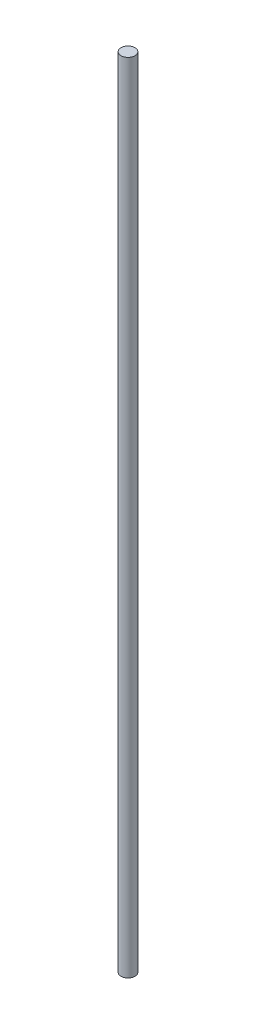
ISO-10303-21;
HEADER;
FILE_DESCRIPTION(('STEP AP214'),'2;1');
FILE_NAME('part.step','',(''),(''),'','','');
FILE_SCHEMA(('AUTOMOTIVE_DESIGN { 1 0 10303 214 1 1 1 1 }'));
ENDSEC;
DATA;
#1=APPLICATION_CONTEXT('core data for automotive mechanical design processes');
#2=APPLICATION_PROTOCOL_DEFINITION('international standard','automotive_design',2000,#1);
#3=PRODUCT_CONTEXT('',#1,'mechanical');
#4=PRODUCT('Part','Part','',(#3));
#5=PRODUCT_RELATED_PRODUCT_CATEGORY('part','',(#4));
#6=PRODUCT_DEFINITION_FORMATION('','',#4);
#7=PRODUCT_DEFINITION_CONTEXT('part definition',#1,'design');
#8=PRODUCT_DEFINITION('design','',#6,#7);
#9=PRODUCT_DEFINITION_SHAPE('','',#8);
#10=(LENGTH_UNIT() NAMED_UNIT(*) SI_UNIT(.MILLI.,.METRE.));
#11=(NAMED_UNIT(*) PLANE_ANGLE_UNIT() SI_UNIT($,.RADIAN.));
#12=(NAMED_UNIT(*) SI_UNIT($,.STERADIAN.) SOLID_ANGLE_UNIT());
#13=UNCERTAINTY_MEASURE_WITH_UNIT(LENGTH_MEASURE(1.E-05),#10,'distance_accuracy_value','');
#14=(GEOMETRIC_REPRESENTATION_CONTEXT(3) GLOBAL_UNCERTAINTY_ASSIGNED_CONTEXT((#13)) GLOBAL_UNIT_ASSIGNED_CONTEXT((#10,
#11,#12)) REPRESENTATION_CONTEXT('',''));
#15=CARTESIAN_POINT('',(0.,0.,0.));
#16=DIRECTION('',(0.,0.,1.));
#17=DIRECTION('',(1.,0.,0.));
#18=AXIS2_PLACEMENT_3D('',#15,#16,#17);
#19=CARTESIAN_POINT('',(0.,160.,0.));
#20=DIRECTION('',(0.,-1.,0.));
#21=DIRECTION('',(0.,0.,-1.));
#22=AXIS2_PLACEMENT_3D('',#19,#20,#21);
#23=CYLINDRICAL_SURFACE('',#22,1.4);
#24=CARTESIAN_POINT('',(0.,160.,0.));
#25=DIRECTION('',(0.,1.,0.));
#26=DIRECTION('',(0.,0.,1.));
#27=AXIS2_PLACEMENT_3D('',#24,#25,#26);
#28=CIRCLE('',#27,1.4);
#29=CARTESIAN_POINT('',(0.,160.,1.4));
#30=VERTEX_POINT('',#29);
#31=EDGE_CURVE('E10',#30,#30,#28,.T.);
#32=ORIENTED_EDGE('',*,*,#31,.F.);
#33=EDGE_LOOP('',(#32));
#34=FACE_BOUND('',#33,.T.);
#35=CARTESIAN_POINT('',(0.,0.,0.));
#36=DIRECTION('',(0.,1.,0.));
#37=DIRECTION('',(0.,0.,1.));
#38=AXIS2_PLACEMENT_3D('',#35,#36,#37);
#39=CIRCLE('',#38,1.4);
#40=CARTESIAN_POINT('',(0.,0.,1.4));
#41=VERTEX_POINT('',#40);
#42=EDGE_CURVE('E37',#41,#41,#39,.T.);
#43=ORIENTED_EDGE('',*,*,#42,.T.);
#44=EDGE_LOOP('',(#43));
#45=FACE_BOUND('',#44,.T.);
#46=ADVANCED_FACE('F34',(#34,#45),#23,.T.);
#47=CARTESIAN_POINT('',(0.,160.,0.));
#48=DIRECTION('',(0.,1.,0.));
#49=DIRECTION('',(0.,0.,1.));
#50=AXIS2_PLACEMENT_3D('',#47,#48,#49);
#51=PLANE('',#50);
#52=ORIENTED_EDGE('',*,*,#31,.T.);
#53=EDGE_LOOP('',(#52));
#54=FACE_BOUND('',#53,.T.);
#55=ADVANCED_FACE('F49',(#54),#51,.T.);
#56=CARTESIAN_POINT('',(0.,0.,0.));
#57=DIRECTION('',(0.,1.,0.));
#58=DIRECTION('',(0.,0.,1.));
#59=AXIS2_PLACEMENT_3D('',#56,#57,#58);
#60=PLANE('',#59);
#61=ORIENTED_EDGE('',*,*,#42,.F.);
#62=EDGE_LOOP('',(#61));
#63=FACE_BOUND('',#62,.T.);
#64=ADVANCED_FACE('F47',(#63),#60,.F.);
#65=CLOSED_SHELL('',(#46,#55,#64));
#66=MANIFOLD_SOLID_BREP('B2',#65);
#67=ADVANCED_BREP_SHAPE_REPRESENTATION('',(#18,#66),#14);
#68=SHAPE_DEFINITION_REPRESENTATION(#9,#67);
ENDSEC;
END-ISO-10303-21;
